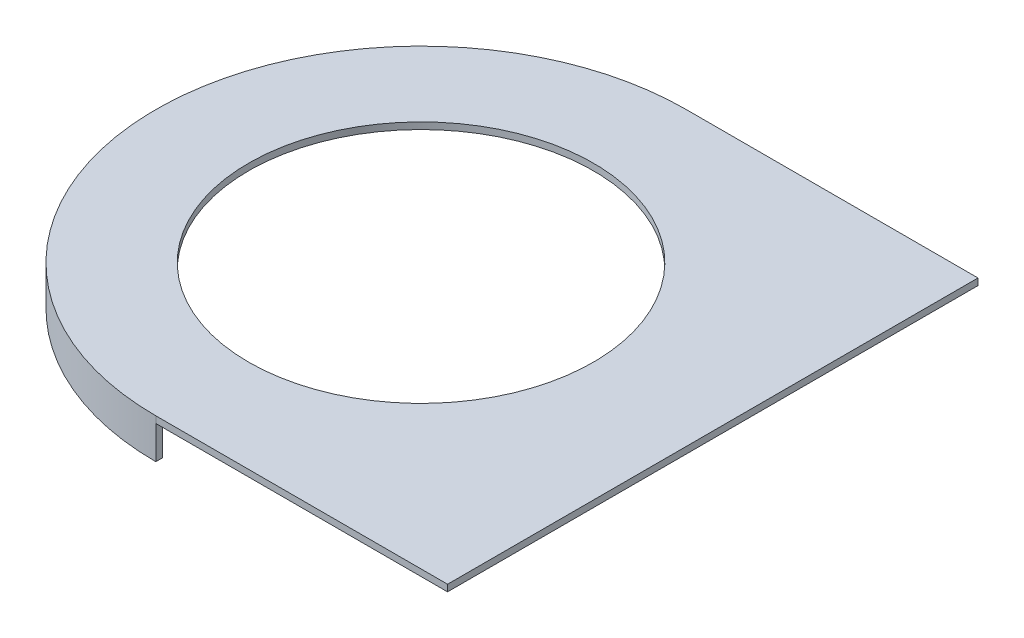
ISO-10303-21;
HEADER;
FILE_DESCRIPTION(('STEP AP214'),'2;1');
FILE_NAME('part.step','',(''),(''),'','','');
FILE_SCHEMA(('AUTOMOTIVE_DESIGN { 1 0 10303 214 1 1 1 1 }'));
ENDSEC;
DATA;
#1=APPLICATION_CONTEXT('core data for automotive mechanical design processes');
#2=APPLICATION_PROTOCOL_DEFINITION('international standard','automotive_design',2000,#1);
#3=PRODUCT_CONTEXT('',#1,'mechanical');
#4=PRODUCT('Part','Part','',(#3));
#5=PRODUCT_RELATED_PRODUCT_CATEGORY('part','',(#4));
#6=PRODUCT_DEFINITION_FORMATION('','',#4);
#7=PRODUCT_DEFINITION_CONTEXT('part definition',#1,'design');
#8=PRODUCT_DEFINITION('design','',#6,#7);
#9=PRODUCT_DEFINITION_SHAPE('','',#8);
#10=(LENGTH_UNIT() NAMED_UNIT(*) SI_UNIT(.MILLI.,.METRE.));
#11=(NAMED_UNIT(*) PLANE_ANGLE_UNIT() SI_UNIT($,.RADIAN.));
#12=(NAMED_UNIT(*) SI_UNIT($,.STERADIAN.) SOLID_ANGLE_UNIT());
#13=UNCERTAINTY_MEASURE_WITH_UNIT(LENGTH_MEASURE(1.E-05),#10,'distance_accuracy_value','');
#14=(GEOMETRIC_REPRESENTATION_CONTEXT(3) GLOBAL_UNCERTAINTY_ASSIGNED_CONTEXT((#13)) GLOBAL_UNIT_ASSIGNED_CONTEXT((#10,
#11,#12)) REPRESENTATION_CONTEXT('',''));
#15=CARTESIAN_POINT('',(0.,0.,0.));
#16=DIRECTION('',(0.,0.,1.));
#17=DIRECTION('',(1.,0.,0.));
#18=AXIS2_PLACEMENT_3D('',#15,#16,#17);
#19=CARTESIAN_POINT('',(0.,0.5,0.));
#20=DIRECTION('',(0.,-1.,0.));
#21=DIRECTION('',(0.,0.,-1.));
#22=AXIS2_PLACEMENT_3D('',#19,#20,#21);
#23=CYLINDRICAL_SURFACE('',#22,20.);
#24=DIRECTION('',(0.,-1.,0.));
#25=VECTOR('',#24,1.);
#26=CARTESIAN_POINT('',(0.,0.5,-20.));
#27=LINE('',#26,#25);
#28=CARTESIAN_POINT('',(0.,0.5,-20.));
#29=VERTEX_POINT('',#28);
#30=CARTESIAN_POINT('',(0.,0.,-20.));
#31=VERTEX_POINT('',#30);
#32=EDGE_CURVE('E60',#29,#31,#27,.T.);
#33=ORIENTED_EDGE('',*,*,#32,.T.);
#34=DIRECTION('',(0.,1.,0.));
#35=VECTOR('',#34,1.);
#36=CARTESIAN_POINT('',(0.,-2.5,-20.));
#37=LINE('',#36,#35);
#38=CARTESIAN_POINT('',(0.,-2.5,-20.));
#39=VERTEX_POINT('',#38);
#40=EDGE_CURVE('E128',#39,#31,#37,.T.);
#41=ORIENTED_EDGE('',*,*,#40,.F.);
#42=CARTESIAN_POINT('',(0.,-2.5,0.));
#43=DIRECTION('',(0.,-1.,0.));
#44=DIRECTION('',(0.,0.,-1.));
#45=AXIS2_PLACEMENT_3D('',#42,#43,#44);
#46=CIRCLE('',#45,20.);
#47=CARTESIAN_POINT('',(0.,-2.5,20.));
#48=VERTEX_POINT('',#47);
#49=EDGE_CURVE('E123',#48,#39,#46,.T.);
#50=ORIENTED_EDGE('',*,*,#49,.F.);
#51=DIRECTION('',(0.,1.,0.));
#52=VECTOR('',#51,1.);
#53=CARTESIAN_POINT('',(0.,-2.5,20.));
#54=LINE('',#53,#52);
#55=CARTESIAN_POINT('',(0.,0.,20.));
#56=VERTEX_POINT('',#55);
#57=EDGE_CURVE('E111',#48,#56,#54,.T.);
#58=ORIENTED_EDGE('',*,*,#57,.T.);
#59=DIRECTION('',(0.,-1.,0.));
#60=VECTOR('',#59,1.);
#61=CARTESIAN_POINT('',(0.,0.5,20.));
#62=LINE('',#61,#60);
#63=CARTESIAN_POINT('',(0.,0.5,20.));
#64=VERTEX_POINT('',#63);
#65=EDGE_CURVE('E11',#64,#56,#62,.T.);
#66=ORIENTED_EDGE('',*,*,#65,.F.);
#67=CARTESIAN_POINT('',(0.,0.5,0.));
#68=DIRECTION('',(0.,1.,0.));
#69=DIRECTION('',(0.,0.,1.));
#70=AXIS2_PLACEMENT_3D('',#67,#68,#69);
#71=CIRCLE('',#70,20.);
#72=EDGE_CURVE('E137',#29,#64,#71,.T.);
#73=ORIENTED_EDGE('',*,*,#72,.F.);
#74=EDGE_LOOP('',(#33,#41,#50,#58,#66,#73));
#75=FACE_BOUND('',#74,.T.);
#76=ADVANCED_FACE('F36',(#75),#23,.T.);
#77=CARTESIAN_POINT('',(0.,0.5,20.));
#78=DIRECTION('',(0.,0.,-1.));
#79=DIRECTION('',(-1.,0.,0.));
#80=AXIS2_PLACEMENT_3D('',#77,#78,#79);
#81=PLANE('',#80);
#82=DIRECTION('',(1.,0.,0.));
#83=VECTOR('',#82,1.);
#84=CARTESIAN_POINT('',(0.,0.,20.));
#85=LINE('',#84,#83);
#86=CARTESIAN_POINT('',(22.,0.,20.));
#87=VERTEX_POINT('',#86);
#88=EDGE_CURVE('E110',#56,#87,#85,.T.);
#89=ORIENTED_EDGE('',*,*,#88,.T.);
#90=DIRECTION('',(0.,-1.,0.));
#91=VECTOR('',#90,1.);
#92=CARTESIAN_POINT('',(22.,0.5,20.));
#93=LINE('',#92,#91);
#94=CARTESIAN_POINT('',(22.,0.5,20.));
#95=VERTEX_POINT('',#94);
#96=EDGE_CURVE('E44',#95,#87,#93,.T.);
#97=ORIENTED_EDGE('',*,*,#96,.F.);
#98=DIRECTION('',(1.,0.,0.));
#99=VECTOR('',#98,1.);
#100=CARTESIAN_POINT('',(0.,0.5,20.));
#101=LINE('',#100,#99);
#102=EDGE_CURVE('E80',#64,#95,#101,.T.);
#103=ORIENTED_EDGE('',*,*,#102,.F.);
#104=ORIENTED_EDGE('',*,*,#65,.T.);
#105=EDGE_LOOP('',(#89,#97,#103,#104));
#106=FACE_BOUND('',#105,.T.);
#107=ADVANCED_FACE('F159',(#106),#81,.F.);
#108=CARTESIAN_POINT('',(22.,0.5,0.));
#109=DIRECTION('',(1.,0.,0.));
#110=DIRECTION('',(0.,0.,-1.));
#111=AXIS2_PLACEMENT_3D('',#108,#109,#110);
#112=PLANE('',#111);
#113=DIRECTION('',(0.,0.,1.));
#114=VECTOR('',#113,1.);
#115=CARTESIAN_POINT('',(22.,0.,0.));
#116=LINE('',#115,#114);
#117=CARTESIAN_POINT('',(22.,0.,-20.));
#118=VERTEX_POINT('',#117);
#119=EDGE_CURVE('E148',#118,#87,#116,.T.);
#120=ORIENTED_EDGE('',*,*,#119,.F.);
#121=DIRECTION('',(0.,-1.,0.));
#122=VECTOR('',#121,1.);
#123=CARTESIAN_POINT('',(22.,0.5,-20.));
#124=LINE('',#123,#122);
#125=CARTESIAN_POINT('',(22.,0.5,-20.));
#126=VERTEX_POINT('',#125);
#127=EDGE_CURVE('E73',#126,#118,#124,.T.);
#128=ORIENTED_EDGE('',*,*,#127,.F.);
#129=DIRECTION('',(0.,0.,1.));
#130=VECTOR('',#129,1.);
#131=CARTESIAN_POINT('',(22.,0.5,0.));
#132=LINE('',#131,#130);
#133=EDGE_CURVE('E141',#126,#95,#132,.T.);
#134=ORIENTED_EDGE('',*,*,#133,.T.);
#135=ORIENTED_EDGE('',*,*,#96,.T.);
#136=EDGE_LOOP('',(#120,#128,#134,#135));
#137=FACE_BOUND('',#136,.T.);
#138=ADVANCED_FACE('F156',(#137),#112,.T.);
#139=CARTESIAN_POINT('',(0.,0.5,-20.));
#140=DIRECTION('',(0.,0.,-1.));
#141=DIRECTION('',(-1.,0.,0.));
#142=AXIS2_PLACEMENT_3D('',#139,#140,#141);
#143=PLANE('',#142);
#144=DIRECTION('',(1.,0.,0.));
#145=VECTOR('',#144,1.);
#146=CARTESIAN_POINT('',(0.,0.,-20.));
#147=LINE('',#146,#145);
#148=EDGE_CURVE('E139',#31,#118,#147,.T.);
#149=ORIENTED_EDGE('',*,*,#148,.F.);
#150=ORIENTED_EDGE('',*,*,#32,.F.);
#151=DIRECTION('',(1.,0.,0.));
#152=VECTOR('',#151,1.);
#153=CARTESIAN_POINT('',(0.,0.5,-20.));
#154=LINE('',#153,#152);
#155=EDGE_CURVE('E144',#29,#126,#154,.T.);
#156=ORIENTED_EDGE('',*,*,#155,.T.);
#157=ORIENTED_EDGE('',*,*,#127,.T.);
#158=EDGE_LOOP('',(#149,#150,#156,#157));
#159=FACE_BOUND('',#158,.T.);
#160=ADVANCED_FACE('F164',(#159),#143,.T.);
#161=CARTESIAN_POINT('',(0.,0.5,0.));
#162=DIRECTION('',(0.,1.,0.));
#163=DIRECTION('',(0.,0.,1.));
#164=AXIS2_PLACEMENT_3D('',#161,#162,#163);
#165=PLANE('',#164);
#166=CARTESIAN_POINT('',(0.,0.5,0.));
#167=DIRECTION('',(0.,1.,0.));
#168=DIRECTION('',(0.,0.,1.));
#169=AXIS2_PLACEMENT_3D('',#166,#167,#168);
#170=CIRCLE('',#169,13.);
#171=CARTESIAN_POINT('',(0.,0.5,13.));
#172=VERTEX_POINT('',#171);
#173=EDGE_CURVE('E185',#172,#172,#170,.T.);
#174=ORIENTED_EDGE('',*,*,#173,.F.);
#175=EDGE_LOOP('',(#174));
#176=FACE_BOUND('',#175,.T.);
#177=ORIENTED_EDGE('',*,*,#72,.T.);
#178=ORIENTED_EDGE('',*,*,#102,.T.);
#179=ORIENTED_EDGE('',*,*,#133,.F.);
#180=ORIENTED_EDGE('',*,*,#155,.F.);
#181=EDGE_LOOP('',(#177,#178,#179,#180));
#182=FACE_BOUND('',#181,.T.);
#183=ADVANCED_FACE('F166',(#176,#182),#165,.T.);
#184=CARTESIAN_POINT('',(0.,0.,0.));
#185=DIRECTION('',(0.,1.,0.));
#186=DIRECTION('',(0.,0.,1.));
#187=AXIS2_PLACEMENT_3D('',#184,#185,#186);
#188=PLANE('',#187);
#189=CARTESIAN_POINT('',(0.,0.,0.));
#190=DIRECTION('',(0.,1.,0.));
#191=DIRECTION('',(0.,0.,1.));
#192=AXIS2_PLACEMENT_3D('',#189,#190,#191);
#193=CIRCLE('',#192,13.);
#194=CARTESIAN_POINT('',(0.,0.,13.));
#195=VERTEX_POINT('',#194);
#196=EDGE_CURVE('E39',#195,#195,#193,.T.);
#197=ORIENTED_EDGE('',*,*,#196,.T.);
#198=EDGE_LOOP('',(#197));
#199=FACE_BOUND('',#198,.T.);
#200=CARTESIAN_POINT('',(0.,0.,0.));
#201=DIRECTION('',(0.,-1.,0.));
#202=DIRECTION('',(0.,0.,-1.));
#203=AXIS2_PLACEMENT_3D('',#200,#201,#202);
#204=CIRCLE('',#203,19.5);
#205=CARTESIAN_POINT('',(0.,0.,19.5));
#206=VERTEX_POINT('',#205);
#207=CARTESIAN_POINT('',(0.,0.,-19.5));
#208=VERTEX_POINT('',#207);
#209=EDGE_CURVE('E51',#206,#208,#204,.T.);
#210=ORIENTED_EDGE('',*,*,#209,.T.);
#211=DIRECTION('',(0.,0.,-1.));
#212=VECTOR('',#211,1.);
#213=CARTESIAN_POINT('',(0.,0.,0.));
#214=LINE('',#213,#212);
#215=EDGE_CURVE('E119',#208,#31,#214,.T.);
#216=ORIENTED_EDGE('',*,*,#215,.T.);
#217=ORIENTED_EDGE('',*,*,#148,.T.);
#218=ORIENTED_EDGE('',*,*,#119,.T.);
#219=ORIENTED_EDGE('',*,*,#88,.F.);
#220=EDGE_CURVE('E133',#56,#206,#214,.T.);
#221=ORIENTED_EDGE('',*,*,#220,.T.);
#222=EDGE_LOOP('',(#210,#216,#217,#218,#219,#221));
#223=FACE_BOUND('',#222,.T.);
#224=ADVANCED_FACE('F162',(#199,#223),#188,.F.);
#225=CARTESIAN_POINT('',(0.,-2.5,0.));
#226=DIRECTION('',(0.,1.,0.));
#227=DIRECTION('',(0.,0.,1.));
#228=AXIS2_PLACEMENT_3D('',#225,#226,#227);
#229=CYLINDRICAL_SURFACE('',#228,19.5);
#230=ORIENTED_EDGE('',*,*,#209,.F.);
#231=DIRECTION('',(0.,1.,0.));
#232=VECTOR('',#231,1.);
#233=CARTESIAN_POINT('',(0.,-2.5,19.5));
#234=LINE('',#233,#232);
#235=CARTESIAN_POINT('',(0.,-2.5,19.5));
#236=VERTEX_POINT('',#235);
#237=EDGE_CURVE('E101',#236,#206,#234,.T.);
#238=ORIENTED_EDGE('',*,*,#237,.F.);
#239=CARTESIAN_POINT('',(0.,-2.5,0.));
#240=DIRECTION('',(0.,-1.,0.));
#241=DIRECTION('',(0.,0.,-1.));
#242=AXIS2_PLACEMENT_3D('',#239,#240,#241);
#243=CIRCLE('',#242,19.5);
#244=CARTESIAN_POINT('',(0.,-2.5,-19.5));
#245=VERTEX_POINT('',#244);
#246=EDGE_CURVE('E104',#236,#245,#243,.T.);
#247=ORIENTED_EDGE('',*,*,#246,.T.);
#248=DIRECTION('',(0.,1.,0.));
#249=VECTOR('',#248,1.);
#250=CARTESIAN_POINT('',(0.,-2.5,-19.5));
#251=LINE('',#250,#249);
#252=EDGE_CURVE('E126',#245,#208,#251,.T.);
#253=ORIENTED_EDGE('',*,*,#252,.T.);
#254=EDGE_LOOP('',(#230,#238,#247,#253));
#255=FACE_BOUND('',#254,.T.);
#256=ADVANCED_FACE('F103',(#255),#229,.F.);
#257=CARTESIAN_POINT('',(0.,-2.5,0.));
#258=DIRECTION('',(1.,0.,0.));
#259=DIRECTION('',(0.,0.,-1.));
#260=AXIS2_PLACEMENT_3D('',#257,#258,#259);
#261=PLANE('',#260);
#262=ORIENTED_EDGE('',*,*,#220,.F.);
#263=ORIENTED_EDGE('',*,*,#57,.F.);
#264=DIRECTION('',(0.,0.,-1.));
#265=VECTOR('',#264,1.);
#266=CARTESIAN_POINT('',(0.,-2.5,0.));
#267=LINE('',#266,#265);
#268=EDGE_CURVE('E116',#48,#236,#267,.T.);
#269=ORIENTED_EDGE('',*,*,#268,.T.);
#270=ORIENTED_EDGE('',*,*,#237,.T.);
#271=EDGE_LOOP('',(#262,#263,#269,#270));
#272=FACE_BOUND('',#271,.T.);
#273=ADVANCED_FACE('F121',(#272),#261,.T.);
#274=ORIENTED_EDGE('',*,*,#215,.F.);
#275=ORIENTED_EDGE('',*,*,#252,.F.);
#276=EDGE_CURVE('E118',#245,#39,#267,.T.);
#277=ORIENTED_EDGE('',*,*,#276,.T.);
#278=ORIENTED_EDGE('',*,*,#40,.T.);
#279=EDGE_LOOP('',(#274,#275,#277,#278));
#280=FACE_BOUND('',#279,.T.);
#281=ADVANCED_FACE('F199',(#280),#261,.T.);
#282=CARTESIAN_POINT('',(0.,-2.5,0.));
#283=DIRECTION('',(0.,-1.,0.));
#284=DIRECTION('',(0.,0.,-1.));
#285=AXIS2_PLACEMENT_3D('',#282,#283,#284);
#286=PLANE('',#285);
#287=ORIENTED_EDGE('',*,*,#246,.F.);
#288=ORIENTED_EDGE('',*,*,#268,.F.);
#289=ORIENTED_EDGE('',*,*,#49,.T.);
#290=ORIENTED_EDGE('',*,*,#276,.F.);
#291=EDGE_LOOP('',(#287,#288,#289,#290));
#292=FACE_BOUND('',#291,.T.);
#293=ADVANCED_FACE('F115',(#292),#286,.T.);
#294=CARTESIAN_POINT('',(0.,-2.5,0.));
#295=DIRECTION('',(0.,1.,0.));
#296=DIRECTION('',(0.,0.,1.));
#297=AXIS2_PLACEMENT_3D('',#294,#295,#296);
#298=CYLINDRICAL_SURFACE('',#297,13.);
#299=ORIENTED_EDGE('',*,*,#173,.T.);
#300=EDGE_LOOP('',(#299));
#301=FACE_BOUND('',#300,.T.);
#302=ORIENTED_EDGE('',*,*,#196,.F.);
#303=EDGE_LOOP('',(#302));
#304=FACE_BOUND('',#303,.T.);
#305=ADVANCED_FACE('F192',(#301,#304),#298,.F.);
#306=CLOSED_SHELL('',(#76,#107,#138,#160,#183,#224,#256,#273,#281,#293,#305));
#307=MANIFOLD_SOLID_BREP('B2',#306);
#308=ADVANCED_BREP_SHAPE_REPRESENTATION('',(#18,#307),#14);
#309=SHAPE_DEFINITION_REPRESENTATION(#9,#308);
ENDSEC;
END-ISO-10303-21;
